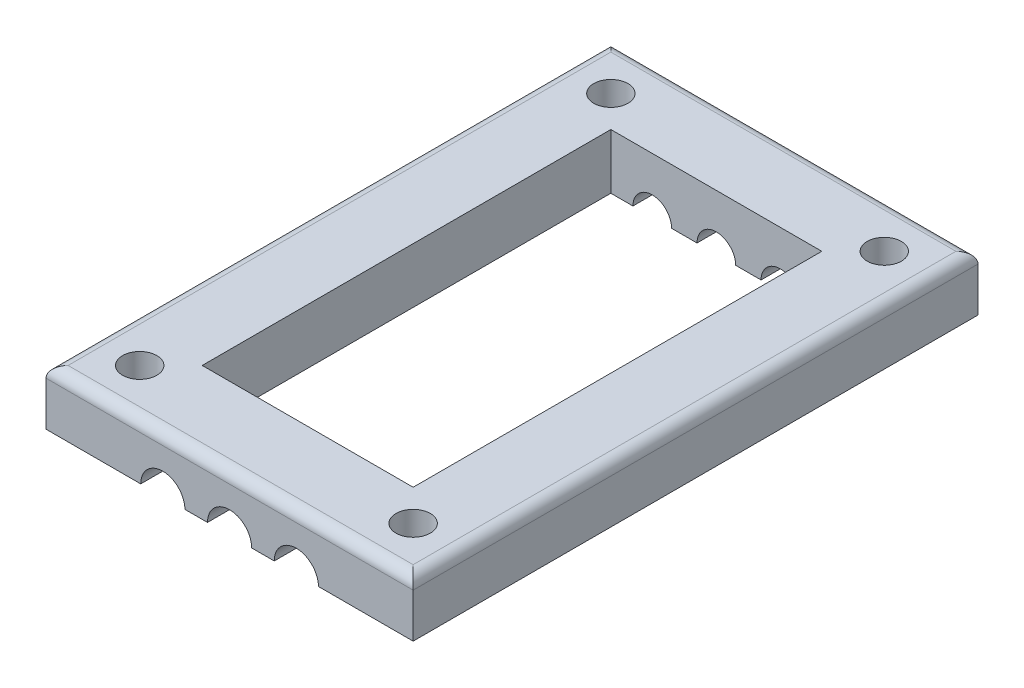
ISO-10303-21;
HEADER;
FILE_DESCRIPTION(('STEP AP214'),'2;1');
FILE_NAME('part.step','',(''),(''),'','','');
FILE_SCHEMA(('AUTOMOTIVE_DESIGN { 1 0 10303 214 1 1 1 1 }'));
ENDSEC;
DATA;
#1=APPLICATION_CONTEXT('core data for automotive mechanical design processes');
#2=APPLICATION_PROTOCOL_DEFINITION('international standard','automotive_design',2000,#1);
#3=PRODUCT_CONTEXT('',#1,'mechanical');
#4=PRODUCT('Part','Part','',(#3));
#5=PRODUCT_RELATED_PRODUCT_CATEGORY('part','',(#4));
#6=PRODUCT_DEFINITION_FORMATION('','',#4);
#7=PRODUCT_DEFINITION_CONTEXT('part definition',#1,'design');
#8=PRODUCT_DEFINITION('design','',#6,#7);
#9=PRODUCT_DEFINITION_SHAPE('','',#8);
#10=(LENGTH_UNIT() NAMED_UNIT(*) SI_UNIT(.MILLI.,.METRE.));
#11=(NAMED_UNIT(*) PLANE_ANGLE_UNIT() SI_UNIT($,.RADIAN.));
#12=(NAMED_UNIT(*) SI_UNIT($,.STERADIAN.) SOLID_ANGLE_UNIT());
#13=UNCERTAINTY_MEASURE_WITH_UNIT(LENGTH_MEASURE(1.E-05),#10,'distance_accuracy_value','');
#14=(GEOMETRIC_REPRESENTATION_CONTEXT(3) GLOBAL_UNCERTAINTY_ASSIGNED_CONTEXT((#13)) GLOBAL_UNIT_ASSIGNED_CONTEXT((#10,
#11,#12)) REPRESENTATION_CONTEXT('',''));
#15=CARTESIAN_POINT('',(0.,0.,0.));
#16=DIRECTION('',(0.,0.,1.));
#17=DIRECTION('',(1.,0.,0.));
#18=AXIS2_PLACEMENT_3D('',#15,#16,#17);
#19=CARTESIAN_POINT('',(-16.6210678118655,25.1031353824411,-35.5810678118655));
#20=DIRECTION('',(0.,-1.,0.));
#21=DIRECTION('',(1.,0.,0.));
#22=AXIS2_PLACEMENT_3D('',#19,#20,#21);
#23=PLANE('',#22);
#24=DIRECTION('',(1.,0.,0.));
#25=VECTOR('',#24,1.);
#26=CARTESIAN_POINT('',(-9.55,25.1031353824411,-28.5));
#27=LINE('',#26,#25);
#28=CARTESIAN_POINT('',(-4.04999999999999,25.1031353824411,-28.5));
#29=VERTEX_POINT('',#28);
#30=CARTESIAN_POINT('',(-1.75,25.1031353824411,-28.5));
#31=VERTEX_POINT('',#30);
#32=EDGE_CURVE('E340',#29,#31,#27,.T.);
#33=ORIENTED_EDGE('',*,*,#32,.F.);
#34=DIRECTION('',(0.,0.,1.));
#35=VECTOR('',#34,1.);
#36=CARTESIAN_POINT('',(-4.04999999999999,25.1031353824411,-35.5720678118655));
#37=LINE('',#36,#35);
#38=CARTESIAN_POINT('',(-4.04999999999999,25.1031353824411,-35.5710678118655));
#39=VERTEX_POINT('',#38);
#40=EDGE_CURVE('E359',#29,#39,#37,.F.);
#41=ORIENTED_EDGE('',*,*,#40,.T.);
#42=DIRECTION('',(-1.,0.,0.));
#43=VECTOR('',#42,1.);
#44=CARTESIAN_POINT('',(0.,25.1031353824411,-35.5710678118655));
#45=LINE('',#44,#43);
#46=CARTESIAN_POINT('',(-1.75,25.1031353824411,-35.5710678118655));
#47=VERTEX_POINT('',#46);
#48=EDGE_CURVE('E409',#47,#39,#45,.T.);
#49=ORIENTED_EDGE('',*,*,#48,.F.);
#50=DIRECTION('',(0.,0.,1.));
#51=VECTOR('',#50,1.);
#52=CARTESIAN_POINT('',(-1.75,25.1031353824411,-35.5720678118655));
#53=LINE('',#52,#51);
#54=EDGE_CURVE('E368',#47,#31,#53,.T.);
#55=ORIENTED_EDGE('',*,*,#54,.T.);
#56=EDGE_LOOP('',(#33,#41,#49,#55));
#57=FACE_BOUND('',#56,.T.);
#58=ADVANCED_FACE('F43',(#57),#23,.T.);
#59=CARTESIAN_POINT('',(1.75000000000001,25.1031353824411,-28.5));
#60=VERTEX_POINT('',#59);
#61=CARTESIAN_POINT('',(4.05,25.1031353824411,-28.5));
#62=VERTEX_POINT('',#61);
#63=EDGE_CURVE('E449',#60,#62,#27,.T.);
#64=ORIENTED_EDGE('',*,*,#63,.F.);
#65=DIRECTION('',(0.,0.,1.));
#66=VECTOR('',#65,1.);
#67=CARTESIAN_POINT('',(1.75000000000001,25.1031353824411,-35.5720678118655));
#68=LINE('',#67,#66);
#69=CARTESIAN_POINT('',(1.75000000000001,25.1031353824411,-35.5710678118655));
#70=VERTEX_POINT('',#69);
#71=EDGE_CURVE('E365',#60,#70,#68,.F.);
#72=ORIENTED_EDGE('',*,*,#71,.T.);
#73=CARTESIAN_POINT('',(4.05,25.1031353824411,-35.5710678118655));
#74=VERTEX_POINT('',#73);
#75=EDGE_CURVE('E351',#74,#70,#45,.T.);
#76=ORIENTED_EDGE('',*,*,#75,.F.);
#77=DIRECTION('',(0.,0.,1.));
#78=VECTOR('',#77,1.);
#79=CARTESIAN_POINT('',(4.05,25.1031353824411,-35.5720678118655));
#80=LINE('',#79,#78);
#81=EDGE_CURVE('E374',#74,#62,#80,.T.);
#82=ORIENTED_EDGE('',*,*,#81,.T.);
#83=EDGE_LOOP('',(#64,#72,#76,#82));
#84=FACE_BOUND('',#83,.T.);
#85=ADVANCED_FACE('F445',(#84),#23,.T.);
#86=DIRECTION('',(-1.,0.,0.));
#87=VECTOR('',#86,1.);
#88=CARTESIAN_POINT('',(0.,25.1031353824411,15.5710678118655));
#89=LINE('',#88,#87);
#90=CARTESIAN_POINT('',(4.045,25.1031353824411,15.5710678118655));
#91=VERTEX_POINT('',#90);
#92=CARTESIAN_POINT('',(2.00000000000001,25.1031353824411,15.5710678118655));
#93=VERTEX_POINT('',#92);
#94=EDGE_CURVE('E389',#91,#93,#89,.T.);
#95=ORIENTED_EDGE('',*,*,#94,.T.);
#96=DIRECTION('',(0.,0.,-1.));
#97=VECTOR('',#96,1.);
#98=CARTESIAN_POINT('',(2.00000000000001,25.1031353824411,15.5720678118655));
#99=LINE('',#98,#97);
#100=CARTESIAN_POINT('',(2.00000000000001,25.1031353824411,8.5));
#101=VERTEX_POINT('',#100);
#102=EDGE_CURVE('E380',#93,#101,#99,.T.);
#103=ORIENTED_EDGE('',*,*,#102,.T.);
#104=DIRECTION('',(-1.,0.,0.));
#105=VECTOR('',#104,1.);
#106=CARTESIAN_POINT('',(-9.55,25.1031353824411,8.5));
#107=LINE('',#106,#105);
#108=CARTESIAN_POINT('',(4.045,25.1031353824411,8.5));
#109=VERTEX_POINT('',#108);
#110=EDGE_CURVE('E334',#109,#101,#107,.T.);
#111=ORIENTED_EDGE('',*,*,#110,.F.);
#112=DIRECTION('',(0.,0.,-1.));
#113=VECTOR('',#112,1.);
#114=CARTESIAN_POINT('',(4.045,25.1031353824411,15.5720678118655));
#115=LINE('',#114,#113);
#116=EDGE_CURVE('E229',#109,#91,#115,.F.);
#117=ORIENTED_EDGE('',*,*,#116,.T.);
#118=EDGE_LOOP('',(#95,#103,#111,#117));
#119=FACE_BOUND('',#118,.T.);
#120=ADVANCED_FACE('F387',(#119),#23,.T.);
#121=CARTESIAN_POINT('',(16.6210678118655,25.1031353824411,-35.5710678118655));
#122=VERTEX_POINT('',#121);
#123=CARTESIAN_POINT('',(7.55000000000001,25.1031353824411,-35.5710678118655));
#124=VERTEX_POINT('',#123);
#125=EDGE_CURVE('E348',#122,#124,#45,.T.);
#126=ORIENTED_EDGE('',*,*,#125,.F.);
#127=DIRECTION('',(0.,0.,1.));
#128=VECTOR('',#127,1.);
#129=CARTESIAN_POINT('',(16.6210678118655,25.1031353824411,-35.5810678118655));
#130=LINE('',#129,#128);
#131=CARTESIAN_POINT('',(16.6210678118655,25.1031353824411,15.5710678118655));
#132=VERTEX_POINT('',#131);
#133=EDGE_CURVE('E352',#122,#132,#130,.T.);
#134=ORIENTED_EDGE('',*,*,#133,.T.);
#135=CARTESIAN_POINT('',(8.04500000000001,25.1031353824411,15.5710678118655));
#136=VERTEX_POINT('',#135);
#137=EDGE_CURVE('E355',#132,#136,#89,.T.);
#138=ORIENTED_EDGE('',*,*,#137,.T.);
#139=DIRECTION('',(0.,0.,-1.));
#140=VECTOR('',#139,1.);
#141=CARTESIAN_POINT('',(8.04500000000001,25.1031353824411,15.5720678118655));
#142=LINE('',#141,#140);
#143=CARTESIAN_POINT('',(8.04500000000001,25.1031353824411,8.5));
#144=VERTEX_POINT('',#143);
#145=EDGE_CURVE('E225',#136,#144,#142,.T.);
#146=ORIENTED_EDGE('',*,*,#145,.T.);
#147=CARTESIAN_POINT('',(9.55,25.1031353824411,8.5));
#148=VERTEX_POINT('',#147);
#149=EDGE_CURVE('E222',#148,#144,#107,.T.);
#150=ORIENTED_EDGE('',*,*,#149,.F.);
#151=DIRECTION('',(0.,0.,1.));
#152=VECTOR('',#151,1.);
#153=CARTESIAN_POINT('',(9.55,25.1031353824411,-28.5));
#154=LINE('',#153,#152);
#155=CARTESIAN_POINT('',(9.55,25.1031353824411,-28.5));
#156=VERTEX_POINT('',#155);
#157=EDGE_CURVE('E341',#156,#148,#154,.T.);
#158=ORIENTED_EDGE('',*,*,#157,.F.);
#159=CARTESIAN_POINT('',(7.55000000000001,25.1031353824411,-28.5));
#160=VERTEX_POINT('',#159);
#161=EDGE_CURVE('E336',#160,#156,#27,.T.);
#162=ORIENTED_EDGE('',*,*,#161,.F.);
#163=DIRECTION('',(0.,0.,1.));
#164=VECTOR('',#163,1.);
#165=CARTESIAN_POINT('',(7.55000000000001,25.1031353824411,-35.5720678118655));
#166=LINE('',#165,#164);
#167=EDGE_CURVE('E371',#160,#124,#166,.F.);
#168=ORIENTED_EDGE('',*,*,#167,.T.);
#169=EDGE_LOOP('',(#126,#134,#138,#146,#150,#158,#162,#168));
#170=FACE_BOUND('',#169,.T.);
#171=CARTESIAN_POINT('',(12.3784271247462,25.1031353824411,-31.3284271247462));
#172=DIRECTION('',(0.,-1.,0.));
#173=DIRECTION('',(1.,0.,0.));
#174=AXIS2_PLACEMENT_3D('',#171,#172,#173);
#175=CIRCLE('',#174,1.54999999999999);
#176=CARTESIAN_POINT('',(13.9284271247462,25.1031353824411,-31.3284271247462));
#177=VERTEX_POINT('',#176);
#178=EDGE_CURVE('E325',#177,#177,#175,.T.);
#179=ORIENTED_EDGE('',*,*,#178,.F.);
#180=EDGE_LOOP('',(#179));
#181=FACE_BOUND('',#180,.T.);
#182=CARTESIAN_POINT('',(12.3784271247462,25.1031353824411,11.3284271247462));
#183=DIRECTION('',(0.,-1.,0.));
#184=DIRECTION('',(1.,0.,0.));
#185=AXIS2_PLACEMENT_3D('',#182,#183,#184);
#186=CIRCLE('',#185,1.55);
#187=CARTESIAN_POINT('',(13.9284271247462,25.1031353824411,11.3284271247462));
#188=VERTEX_POINT('',#187);
#189=EDGE_CURVE('E328',#188,#188,#186,.T.);
#190=ORIENTED_EDGE('',*,*,#189,.F.);
#191=EDGE_LOOP('',(#190));
#192=FACE_BOUND('',#191,.T.);
#193=ADVANCED_FACE('F435',(#170,#181,#192),#23,.T.);
#194=CARTESIAN_POINT('',(-7.55,25.1031353824411,-35.5710678118655));
#195=VERTEX_POINT('',#194);
#196=CARTESIAN_POINT('',(-16.6210678118655,25.1031353824411,-35.5710678118655));
#197=VERTEX_POINT('',#196);
#198=EDGE_CURVE('E347',#195,#197,#45,.T.);
#199=ORIENTED_EDGE('',*,*,#198,.F.);
#200=DIRECTION('',(0.,0.,1.));
#201=VECTOR('',#200,1.);
#202=CARTESIAN_POINT('',(-7.55,25.1031353824411,-35.5720678118655));
#203=LINE('',#202,#201);
#204=CARTESIAN_POINT('',(-7.55,25.1031353824411,-28.5));
#205=VERTEX_POINT('',#204);
#206=EDGE_CURVE('E362',#195,#205,#203,.T.);
#207=ORIENTED_EDGE('',*,*,#206,.T.);
#208=CARTESIAN_POINT('',(-9.55,25.1031353824411,-28.5));
#209=VERTEX_POINT('',#208);
#210=EDGE_CURVE('E337',#209,#205,#27,.T.);
#211=ORIENTED_EDGE('',*,*,#210,.F.);
#212=DIRECTION('',(0.,0.,-1.));
#213=VECTOR('',#212,1.);
#214=CARTESIAN_POINT('',(-9.55,25.1031353824411,-28.5));
#215=LINE('',#214,#213);
#216=CARTESIAN_POINT('',(-9.55,25.1031353824411,8.5));
#217=VERTEX_POINT('',#216);
#218=EDGE_CURVE('E218',#217,#209,#215,.T.);
#219=ORIENTED_EDGE('',*,*,#218,.F.);
#220=CARTESIAN_POINT('',(-8.045,25.1031353824411,8.5));
#221=VERTEX_POINT('',#220);
#222=EDGE_CURVE('E199',#221,#217,#107,.T.);
#223=ORIENTED_EDGE('',*,*,#222,.F.);
#224=DIRECTION('',(0.,0.,-1.));
#225=VECTOR('',#224,1.);
#226=CARTESIAN_POINT('',(-8.045,25.1031353824411,15.5720678118655));
#227=LINE('',#226,#225);
#228=CARTESIAN_POINT('',(-8.045,25.1031353824411,15.5710678118655));
#229=VERTEX_POINT('',#228);
#230=EDGE_CURVE('E216',#221,#229,#227,.F.);
#231=ORIENTED_EDGE('',*,*,#230,.T.);
#232=CARTESIAN_POINT('',(-16.6210678118655,25.1031353824411,15.5710678118655));
#233=VERTEX_POINT('',#232);
#234=EDGE_CURVE('E356',#229,#233,#89,.T.);
#235=ORIENTED_EDGE('',*,*,#234,.T.);
#236=DIRECTION('',(0.,0.,1.));
#237=VECTOR('',#236,1.);
#238=CARTESIAN_POINT('',(-16.6210678118655,25.1031353824411,-35.5810678118655));
#239=LINE('',#238,#237);
#240=EDGE_CURVE('E344',#197,#233,#239,.T.);
#241=ORIENTED_EDGE('',*,*,#240,.F.);
#242=EDGE_LOOP('',(#199,#207,#211,#219,#223,#231,#235,#241));
#243=FACE_BOUND('',#242,.T.);
#244=CARTESIAN_POINT('',(-12.3784271247462,25.1031353824411,-31.3284271247462));
#245=DIRECTION('',(0.,-1.,0.));
#246=DIRECTION('',(1.,0.,0.));
#247=AXIS2_PLACEMENT_3D('',#244,#245,#246);
#248=CIRCLE('',#247,1.54999999999999);
#249=CARTESIAN_POINT('',(-10.8284271247462,25.1031353824411,-31.3284271247462));
#250=VERTEX_POINT('',#249);
#251=EDGE_CURVE('E292',#250,#250,#248,.T.);
#252=ORIENTED_EDGE('',*,*,#251,.F.);
#253=EDGE_LOOP('',(#252));
#254=FACE_BOUND('',#253,.T.);
#255=CARTESIAN_POINT('',(-12.3784271247462,25.1031353824411,11.3284271247462));
#256=DIRECTION('',(0.,-1.,0.));
#257=DIRECTION('',(1.,0.,0.));
#258=AXIS2_PLACEMENT_3D('',#255,#256,#257);
#259=CIRCLE('',#258,1.55);
#260=CARTESIAN_POINT('',(-10.8284271247462,25.1031353824411,11.3284271247462));
#261=VERTEX_POINT('',#260);
#262=EDGE_CURVE('E220',#261,#261,#259,.T.);
#263=ORIENTED_EDGE('',*,*,#262,.F.);
#264=EDGE_LOOP('',(#263));
#265=FACE_BOUND('',#264,.T.);
#266=ADVANCED_FACE('F213',(#243,#254,#265),#23,.T.);
#267=CARTESIAN_POINT('',(-2.,25.1031353824411,8.5));
#268=VERTEX_POINT('',#267);
#269=CARTESIAN_POINT('',(-4.045,25.1031353824411,8.5));
#270=VERTEX_POINT('',#269);
#271=EDGE_CURVE('E202',#268,#270,#107,.T.);
#272=ORIENTED_EDGE('',*,*,#271,.F.);
#273=DIRECTION('',(0.,0.,-1.));
#274=VECTOR('',#273,1.);
#275=CARTESIAN_POINT('',(-2.,25.1031353824411,15.5720678118655));
#276=LINE('',#275,#274);
#277=CARTESIAN_POINT('',(-2.,25.1031353824411,15.5710678118655));
#278=VERTEX_POINT('',#277);
#279=EDGE_CURVE('E377',#268,#278,#276,.F.);
#280=ORIENTED_EDGE('',*,*,#279,.T.);
#281=CARTESIAN_POINT('',(-4.045,25.1031353824411,15.5710678118655));
#282=VERTEX_POINT('',#281);
#283=EDGE_CURVE('E358',#278,#282,#89,.T.);
#284=ORIENTED_EDGE('',*,*,#283,.T.);
#285=DIRECTION('',(0.,0.,-1.));
#286=VECTOR('',#285,1.);
#287=CARTESIAN_POINT('',(-4.045,25.1031353824411,15.5720678118655));
#288=LINE('',#287,#286);
#289=EDGE_CURVE('E226',#282,#270,#288,.T.);
#290=ORIENTED_EDGE('',*,*,#289,.T.);
#291=EDGE_LOOP('',(#272,#280,#284,#290));
#292=FACE_BOUND('',#291,.T.);
#293=ADVANCED_FACE('F399',(#292),#23,.T.);
#294=CARTESIAN_POINT('',(-15.6210678118655,29.1031353824411,0.));
#295=DIRECTION('',(0.,0.,-1.));
#296=DIRECTION('',(-1.,0.,0.));
#297=AXIS2_PLACEMENT_3D('',#294,#295,#296);
#298=CYLINDRICAL_SURFACE('',#297,1.);
#299=CARTESIAN_POINT('',(-15.6210678118655,29.1031353824411,-34.5710678118655));
#300=DIRECTION('',(-0.707106781186547,0.,0.707106781186547));
#301=DIRECTION('',(-0.707106781186547,0.,-0.707106781186547));
#302=AXIS2_PLACEMENT_3D('',#299,#300,#301);
#303=ELLIPSE('',#302,1.41421356237309,1.);
#304=CARTESIAN_POINT('',(-15.6210678118655,30.1031353824411,-34.5710678118655));
#305=VERTEX_POINT('',#304);
#306=CARTESIAN_POINT('',(-16.6210678118655,29.1031353824411,-35.5710678118655));
#307=VERTEX_POINT('',#306);
#308=EDGE_CURVE('E275',#305,#307,#303,.T.);
#309=ORIENTED_EDGE('',*,*,#308,.T.);
#310=DIRECTION('',(0.,0.,1.));
#311=VECTOR('',#310,1.);
#312=CARTESIAN_POINT('',(-16.6210678118655,29.1031353824411,-35.5710678118655));
#313=LINE('',#312,#311);
#314=CARTESIAN_POINT('',(-16.6210678118655,29.1031353824411,15.5710678118655));
#315=VERTEX_POINT('',#314);
#316=EDGE_CURVE('E298',#315,#307,#313,.F.);
#317=ORIENTED_EDGE('',*,*,#316,.F.);
#318=CARTESIAN_POINT('',(-15.6210678118655,29.1031353824411,14.5710678118655));
#319=DIRECTION('',(-0.707106781186547,0.,-0.707106781186547));
#320=DIRECTION('',(0.707106781186547,0.,-0.707106781186547));
#321=AXIS2_PLACEMENT_3D('',#318,#319,#320);
#322=ELLIPSE('',#321,1.41421356237309,1.);
#323=CARTESIAN_POINT('',(-15.6210678118655,30.1031353824411,14.5710678118655));
#324=VERTEX_POINT('',#323);
#325=EDGE_CURVE('E52',#324,#315,#322,.F.);
#326=ORIENTED_EDGE('',*,*,#325,.F.);
#327=DIRECTION('',(0.,0.,1.));
#328=VECTOR('',#327,1.);
#329=CARTESIAN_POINT('',(-15.6210678118655,30.1031353824411,15.5710678118655));
#330=LINE('',#329,#328);
#331=EDGE_CURVE('E291',#305,#324,#330,.T.);
#332=ORIENTED_EDGE('',*,*,#331,.F.);
#333=EDGE_LOOP('',(#309,#317,#326,#332));
#334=FACE_BOUND('',#333,.T.);
#335=ADVANCED_FACE('F412',(#334),#298,.T.);
#336=CARTESIAN_POINT('',(0.,20.1031353824411,-35.5710678118655));
#337=DIRECTION('',(0.,0.,-1.));
#338=DIRECTION('',(-1.,0.,0.));
#339=AXIS2_PLACEMENT_3D('',#336,#337,#338);
#340=PLANE('',#339);
#341=DIRECTION('',(0.,-1.,0.));
#342=VECTOR('',#341,1.);
#343=CARTESIAN_POINT('',(16.6210678118655,20.1031353824411,-35.5710678118655));
#344=LINE('',#343,#342);
#345=CARTESIAN_POINT('',(16.6210678118655,29.1031353824411,-35.5710678118655));
#346=VERTEX_POINT('',#345);
#347=EDGE_CURVE('E234',#346,#122,#344,.T.);
#348=ORIENTED_EDGE('',*,*,#347,.T.);
#349=ORIENTED_EDGE('',*,*,#125,.T.);
#350=CARTESIAN_POINT('',(5.8,25.1031353824411,-35.5710678118655));
#351=DIRECTION('',(0.,0.,-1.));
#352=DIRECTION('',(-1.,0.,0.));
#353=AXIS2_PLACEMENT_3D('',#350,#351,#352);
#354=CIRCLE('',#353,1.75);
#355=EDGE_CURVE('E256',#124,#74,#354,.F.);
#356=ORIENTED_EDGE('',*,*,#355,.T.);
#357=ORIENTED_EDGE('',*,*,#75,.T.);
#358=CARTESIAN_POINT('',(0.,25.1031353824411,-35.5710678118655));
#359=DIRECTION('',(0.,0.,-1.));
#360=DIRECTION('',(-1.,0.,0.));
#361=AXIS2_PLACEMENT_3D('',#358,#359,#360);
#362=CIRCLE('',#361,1.75);
#363=EDGE_CURVE('E259',#70,#47,#362,.F.);
#364=ORIENTED_EDGE('',*,*,#363,.T.);
#365=ORIENTED_EDGE('',*,*,#48,.T.);
#366=CARTESIAN_POINT('',(-5.8,25.1031353824411,-35.5710678118655));
#367=DIRECTION('',(0.,0.,-1.));
#368=DIRECTION('',(-1.,0.,0.));
#369=AXIS2_PLACEMENT_3D('',#366,#367,#368);
#370=CIRCLE('',#369,1.75);
#371=EDGE_CURVE('E263',#39,#195,#370,.F.);
#372=ORIENTED_EDGE('',*,*,#371,.T.);
#373=ORIENTED_EDGE('',*,*,#198,.T.);
#374=DIRECTION('',(0.,-1.,0.));
#375=VECTOR('',#374,1.);
#376=CARTESIAN_POINT('',(-16.6210678118655,20.1031353824411,-35.5710678118655));
#377=LINE('',#376,#375);
#378=EDGE_CURVE('E237',#307,#197,#377,.T.);
#379=ORIENTED_EDGE('',*,*,#378,.F.);
#380=DIRECTION('',(-1.,0.,0.));
#381=VECTOR('',#380,1.);
#382=CARTESIAN_POINT('',(0.,29.1031353824411,-35.5710678118655));
#383=LINE('',#382,#381);
#384=EDGE_CURVE('E300',#307,#346,#383,.F.);
#385=ORIENTED_EDGE('',*,*,#384,.T.);
#386=EDGE_LOOP('',(#348,#349,#356,#357,#364,#365,#372,#373,#379,#385));
#387=FACE_BOUND('',#386,.T.);
#388=ADVANCED_FACE('F406',(#387),#340,.T.);
#389=CARTESIAN_POINT('',(0.,29.1031353824411,-34.5710678118655));
#390=DIRECTION('',(-1.,0.,0.));
#391=DIRECTION('',(0.,0.,1.));
#392=AXIS2_PLACEMENT_3D('',#389,#390,#391);
#393=CYLINDRICAL_SURFACE('',#392,1.);
#394=CARTESIAN_POINT('',(15.6210678118655,29.1031353824411,-34.5710678118655));
#395=DIRECTION('',(-0.707106781186547,0.,-0.707106781186547));
#396=DIRECTION('',(0.707106781186547,0.,-0.707106781186547));
#397=AXIS2_PLACEMENT_3D('',#394,#395,#396);
#398=ELLIPSE('',#397,1.41421356237309,1.);
#399=CARTESIAN_POINT('',(15.6210678118655,30.1031353824411,-34.5710678118655));
#400=VERTEX_POINT('',#399);
#401=EDGE_CURVE('E278',#346,#400,#398,.F.);
#402=ORIENTED_EDGE('',*,*,#401,.F.);
#403=ORIENTED_EDGE('',*,*,#384,.F.);
#404=ORIENTED_EDGE('',*,*,#308,.F.);
#405=DIRECTION('',(-1.,0.,0.));
#406=VECTOR('',#405,1.);
#407=CARTESIAN_POINT('',(0.,30.1031353824411,-34.5710678118655));
#408=LINE('',#407,#406);
#409=EDGE_CURVE('E294',#400,#305,#408,.T.);
#410=ORIENTED_EDGE('',*,*,#409,.F.);
#411=EDGE_LOOP('',(#402,#403,#404,#410));
#412=FACE_BOUND('',#411,.T.);
#413=ADVANCED_FACE('F429',(#412),#393,.T.);
#414=CARTESIAN_POINT('',(-9.55,30.1031353824411,-28.5));
#415=DIRECTION('',(0.,0.,1.));
#416=DIRECTION('',(1.,0.,0.));
#417=AXIS2_PLACEMENT_3D('',#414,#415,#416);
#418=PLANE('',#417);
#419=DIRECTION('',(0.,-1.,0.));
#420=VECTOR('',#419,1.);
#421=CARTESIAN_POINT('',(-9.55,30.1031353824411,-28.5));
#422=LINE('',#421,#420);
#423=CARTESIAN_POINT('',(-9.55,30.1031353824411,-28.5));
#424=VERTEX_POINT('',#423);
#425=EDGE_CURVE('E247',#424,#209,#422,.T.);
#426=ORIENTED_EDGE('',*,*,#425,.T.);
#427=ORIENTED_EDGE('',*,*,#210,.T.);
#428=CARTESIAN_POINT('',(-5.8,25.1031353824411,-28.5));
#429=DIRECTION('',(0.,0.,1.));
#430=DIRECTION('',(1.,0.,0.));
#431=AXIS2_PLACEMENT_3D('',#428,#429,#430);
#432=CIRCLE('',#431,1.75);
#433=EDGE_CURVE('E265',#29,#205,#432,.T.);
#434=ORIENTED_EDGE('',*,*,#433,.F.);
#435=ORIENTED_EDGE('',*,*,#32,.T.);
#436=CARTESIAN_POINT('',(0.,25.1031353824411,-28.5));
#437=DIRECTION('',(0.,0.,1.));
#438=DIRECTION('',(1.,0.,0.));
#439=AXIS2_PLACEMENT_3D('',#436,#437,#438);
#440=CIRCLE('',#439,1.75);
#441=EDGE_CURVE('E261',#60,#31,#440,.T.);
#442=ORIENTED_EDGE('',*,*,#441,.F.);
#443=ORIENTED_EDGE('',*,*,#63,.T.);
#444=CARTESIAN_POINT('',(5.8,25.1031353824411,-28.5));
#445=DIRECTION('',(0.,0.,1.));
#446=DIRECTION('',(1.,0.,0.));
#447=AXIS2_PLACEMENT_3D('',#444,#445,#446);
#448=CIRCLE('',#447,1.75);
#449=EDGE_CURVE('E254',#160,#62,#448,.T.);
#450=ORIENTED_EDGE('',*,*,#449,.F.);
#451=ORIENTED_EDGE('',*,*,#161,.T.);
#452=DIRECTION('',(0.,-1.,0.));
#453=VECTOR('',#452,1.);
#454=CARTESIAN_POINT('',(9.55,30.1031353824411,-28.5));
#455=LINE('',#454,#453);
#456=CARTESIAN_POINT('',(9.55,30.1031353824411,-28.5));
#457=VERTEX_POINT('',#456);
#458=EDGE_CURVE('E245',#457,#156,#455,.T.);
#459=ORIENTED_EDGE('',*,*,#458,.F.);
#460=DIRECTION('',(-1.,0.,0.));
#461=VECTOR('',#460,1.);
#462=CARTESIAN_POINT('',(-9.55,30.1031353824411,-28.5));
#463=LINE('',#462,#461);
#464=EDGE_CURVE('E67',#457,#424,#463,.T.);
#465=ORIENTED_EDGE('',*,*,#464,.T.);
#466=EDGE_LOOP('',(#426,#427,#434,#435,#442,#443,#450,#451,#459,#465));
#467=FACE_BOUND('',#466,.T.);
#468=ADVANCED_FACE('F450',(#467),#418,.T.);
#469=CARTESIAN_POINT('',(5.8,25.1031353824411,-35.5720678118655));
#470=DIRECTION('',(0.,0.,1.));
#471=DIRECTION('',(1.,0.,0.));
#472=AXIS2_PLACEMENT_3D('',#469,#470,#471);
#473=CYLINDRICAL_SURFACE('',#472,1.75);
#474=ORIENTED_EDGE('',*,*,#167,.F.);
#475=ORIENTED_EDGE('',*,*,#449,.T.);
#476=ORIENTED_EDGE('',*,*,#81,.F.);
#477=ORIENTED_EDGE('',*,*,#355,.F.);
#478=EDGE_LOOP('',(#474,#475,#476,#477));
#479=FACE_BOUND('',#478,.T.);
#480=ADVANCED_FACE('F447',(#479),#473,.F.);
#481=CARTESIAN_POINT('',(0.,25.1031353824411,-35.5720678118655));
#482=DIRECTION('',(0.,0.,1.));
#483=DIRECTION('',(1.,0.,0.));
#484=AXIS2_PLACEMENT_3D('',#481,#482,#483);
#485=CYLINDRICAL_SURFACE('',#484,1.75);
#486=ORIENTED_EDGE('',*,*,#71,.F.);
#487=ORIENTED_EDGE('',*,*,#441,.T.);
#488=ORIENTED_EDGE('',*,*,#54,.F.);
#489=ORIENTED_EDGE('',*,*,#363,.F.);
#490=EDGE_LOOP('',(#486,#487,#488,#489));
#491=FACE_BOUND('',#490,.T.);
#492=ADVANCED_FACE('F458',(#491),#485,.F.);
#493=CARTESIAN_POINT('',(-5.8,25.1031353824411,-35.5720678118655));
#494=DIRECTION('',(0.,0.,1.));
#495=DIRECTION('',(1.,0.,0.));
#496=AXIS2_PLACEMENT_3D('',#493,#494,#495);
#497=CYLINDRICAL_SURFACE('',#496,1.75);
#498=ORIENTED_EDGE('',*,*,#40,.F.);
#499=ORIENTED_EDGE('',*,*,#433,.T.);
#500=ORIENTED_EDGE('',*,*,#206,.F.);
#501=ORIENTED_EDGE('',*,*,#371,.F.);
#502=EDGE_LOOP('',(#498,#499,#500,#501));
#503=FACE_BOUND('',#502,.T.);
#504=ADVANCED_FACE('F460',(#503),#497,.F.);
#505=CARTESIAN_POINT('',(-9.55,30.1031353824411,-28.5));
#506=DIRECTION('',(1.,0.,0.));
#507=DIRECTION('',(0.,0.,-1.));
#508=AXIS2_PLACEMENT_3D('',#505,#506,#507);
#509=PLANE('',#508);
#510=DIRECTION('',(0.,-1.,0.));
#511=VECTOR('',#510,1.);
#512=CARTESIAN_POINT('',(-9.55,30.1031353824411,8.5));
#513=LINE('',#512,#511);
#514=CARTESIAN_POINT('',(-9.55,30.1031353824411,8.5));
#515=VERTEX_POINT('',#514);
#516=EDGE_CURVE('E249',#515,#217,#513,.T.);
#517=ORIENTED_EDGE('',*,*,#516,.T.);
#518=ORIENTED_EDGE('',*,*,#218,.T.);
#519=ORIENTED_EDGE('',*,*,#425,.F.);
#520=DIRECTION('',(0.,0.,1.));
#521=VECTOR('',#520,1.);
#522=CARTESIAN_POINT('',(-9.55,30.1031353824411,-28.5));
#523=LINE('',#522,#521);
#524=EDGE_CURVE('E307',#424,#515,#523,.T.);
#525=ORIENTED_EDGE('',*,*,#524,.T.);
#526=EDGE_LOOP('',(#517,#518,#519,#525));
#527=FACE_BOUND('',#526,.T.);
#528=ADVANCED_FACE('F463',(#527),#509,.T.);
#529=CARTESIAN_POINT('',(9.55,30.1031353824411,-28.5));
#530=DIRECTION('',(-1.,0.,0.));
#531=DIRECTION('',(0.,0.,1.));
#532=AXIS2_PLACEMENT_3D('',#529,#530,#531);
#533=PLANE('',#532);
#534=ORIENTED_EDGE('',*,*,#458,.T.);
#535=ORIENTED_EDGE('',*,*,#157,.T.);
#536=DIRECTION('',(0.,-1.,0.));
#537=VECTOR('',#536,1.);
#538=CARTESIAN_POINT('',(9.55,30.1031353824411,8.5));
#539=LINE('',#538,#537);
#540=CARTESIAN_POINT('',(9.55,30.1031353824411,8.5));
#541=VERTEX_POINT('',#540);
#542=EDGE_CURVE('E251',#541,#148,#539,.T.);
#543=ORIENTED_EDGE('',*,*,#542,.F.);
#544=DIRECTION('',(0.,0.,-1.));
#545=VECTOR('',#544,1.);
#546=CARTESIAN_POINT('',(9.55,30.1031353824411,-28.5));
#547=LINE('',#546,#545);
#548=EDGE_CURVE('E60',#541,#457,#547,.T.);
#549=ORIENTED_EDGE('',*,*,#548,.T.);
#550=EDGE_LOOP('',(#534,#535,#543,#549));
#551=FACE_BOUND('',#550,.T.);
#552=ADVANCED_FACE('F467',(#551),#533,.T.);
#553=CARTESIAN_POINT('',(0.,20.1031353824411,15.5710678118655));
#554=DIRECTION('',(0.,0.,-1.));
#555=DIRECTION('',(-1.,0.,0.));
#556=AXIS2_PLACEMENT_3D('',#553,#554,#555);
#557=PLANE('',#556);
#558=ORIENTED_EDGE('',*,*,#137,.F.);
#559=DIRECTION('',(0.,-1.,0.));
#560=VECTOR('',#559,1.);
#561=CARTESIAN_POINT('',(16.6210678118655,20.1031353824411,15.5710678118655));
#562=LINE('',#561,#560);
#563=CARTESIAN_POINT('',(16.6210678118655,29.1031353824411,15.5710678118655));
#564=VERTEX_POINT('',#563);
#565=EDGE_CURVE('E243',#564,#132,#562,.T.);
#566=ORIENTED_EDGE('',*,*,#565,.F.);
#567=DIRECTION('',(1.,0.,0.));
#568=VECTOR('',#567,1.);
#569=CARTESIAN_POINT('',(-16.6210678118655,29.1031353824411,15.5710678118655));
#570=LINE('',#569,#568);
#571=EDGE_CURVE('E238',#564,#315,#570,.F.);
#572=ORIENTED_EDGE('',*,*,#571,.T.);
#573=DIRECTION('',(0.,-1.,0.));
#574=VECTOR('',#573,1.);
#575=CARTESIAN_POINT('',(-16.6210678118655,20.1031353824411,15.5710678118655));
#576=LINE('',#575,#574);
#577=EDGE_CURVE('E241',#315,#233,#576,.T.);
#578=ORIENTED_EDGE('',*,*,#577,.T.);
#579=ORIENTED_EDGE('',*,*,#234,.F.);
#580=CARTESIAN_POINT('',(-6.045,25.1031353824411,15.5710678118655));
#581=DIRECTION('',(0.,0.,-1.));
#582=DIRECTION('',(-1.,0.,0.));
#583=AXIS2_PLACEMENT_3D('',#580,#581,#582);
#584=CIRCLE('',#583,2.);
#585=EDGE_CURVE('E208',#282,#229,#584,.F.);
#586=ORIENTED_EDGE('',*,*,#585,.F.);
#587=ORIENTED_EDGE('',*,*,#283,.F.);
#588=CARTESIAN_POINT('',(0.,25.1031353824411,15.5710678118655));
#589=DIRECTION('',(0.,0.,-1.));
#590=DIRECTION('',(-1.,0.,0.));
#591=AXIS2_PLACEMENT_3D('',#588,#589,#590);
#592=CIRCLE('',#591,2.00000000000001);
#593=EDGE_CURVE('E47',#93,#278,#592,.F.);
#594=ORIENTED_EDGE('',*,*,#593,.F.);
#595=ORIENTED_EDGE('',*,*,#94,.F.);
#596=CARTESIAN_POINT('',(6.045,25.1031353824411,15.5710678118655));
#597=DIRECTION('',(0.,0.,-1.));
#598=DIRECTION('',(-1.,0.,0.));
#599=AXIS2_PLACEMENT_3D('',#596,#597,#598);
#600=CIRCLE('',#599,2.00000000000001);
#601=EDGE_CURVE('E269',#136,#91,#600,.F.);
#602=ORIENTED_EDGE('',*,*,#601,.F.);
#603=EDGE_LOOP('',(#558,#566,#572,#578,#579,#586,#587,#594,#595,#602));
#604=FACE_BOUND('',#603,.T.);
#605=ADVANCED_FACE('F396',(#604),#557,.F.);
#606=CARTESIAN_POINT('',(0.,29.1031353824411,14.5710678118655));
#607=DIRECTION('',(-1.,0.,0.));
#608=DIRECTION('',(0.,0.,1.));
#609=AXIS2_PLACEMENT_3D('',#606,#607,#608);
#610=CYLINDRICAL_SURFACE('',#609,1.);
#611=ORIENTED_EDGE('',*,*,#325,.T.);
#612=ORIENTED_EDGE('',*,*,#571,.F.);
#613=CARTESIAN_POINT('',(15.6210678118655,29.1031353824411,14.5710678118655));
#614=DIRECTION('',(0.707106781186547,0.,-0.707106781186547));
#615=DIRECTION('',(-0.707106781186547,0.,-0.707106781186547));
#616=AXIS2_PLACEMENT_3D('',#613,#614,#615);
#617=ELLIPSE('',#616,1.41421356237309,1.);
#618=CARTESIAN_POINT('',(15.6210678118655,30.1031353824411,14.5710678118655));
#619=VERTEX_POINT('',#618);
#620=EDGE_CURVE('E11',#564,#619,#617,.F.);
#621=ORIENTED_EDGE('',*,*,#620,.T.);
#622=DIRECTION('',(1.,0.,0.));
#623=VECTOR('',#622,1.);
#624=CARTESIAN_POINT('',(16.6210678118655,30.1031353824411,14.5710678118655));
#625=LINE('',#624,#623);
#626=EDGE_CURVE('E288',#324,#619,#625,.T.);
#627=ORIENTED_EDGE('',*,*,#626,.F.);
#628=EDGE_LOOP('',(#611,#612,#621,#627));
#629=FACE_BOUND('',#628,.T.);
#630=ADVANCED_FACE('F418',(#629),#610,.T.);
#631=CARTESIAN_POINT('',(-9.55,30.1031353824411,8.5));
#632=DIRECTION('',(0.,0.,-1.));
#633=DIRECTION('',(-1.,0.,0.));
#634=AXIS2_PLACEMENT_3D('',#631,#632,#633);
#635=PLANE('',#634);
#636=ORIENTED_EDGE('',*,*,#542,.T.);
#637=ORIENTED_EDGE('',*,*,#149,.T.);
#638=CARTESIAN_POINT('',(6.045,25.1031353824411,8.5));
#639=DIRECTION('',(0.,0.,-1.));
#640=DIRECTION('',(-1.,0.,0.));
#641=AXIS2_PLACEMENT_3D('',#638,#639,#640);
#642=CIRCLE('',#641,2.00000000000001);
#643=EDGE_CURVE('E207',#109,#144,#642,.T.);
#644=ORIENTED_EDGE('',*,*,#643,.F.);
#645=ORIENTED_EDGE('',*,*,#110,.T.);
#646=CARTESIAN_POINT('',(0.,25.1031353824411,8.5));
#647=DIRECTION('',(0.,0.,-1.));
#648=DIRECTION('',(-1.,0.,0.));
#649=AXIS2_PLACEMENT_3D('',#646,#647,#648);
#650=CIRCLE('',#649,2.00000000000001);
#651=EDGE_CURVE('E270',#268,#101,#650,.T.);
#652=ORIENTED_EDGE('',*,*,#651,.F.);
#653=ORIENTED_EDGE('',*,*,#271,.T.);
#654=CARTESIAN_POINT('',(-6.045,25.1031353824411,8.5));
#655=DIRECTION('',(0.,0.,-1.));
#656=DIRECTION('',(-1.,0.,0.));
#657=AXIS2_PLACEMENT_3D('',#654,#655,#656);
#658=CIRCLE('',#657,2.);
#659=EDGE_CURVE('E195',#221,#270,#658,.T.);
#660=ORIENTED_EDGE('',*,*,#659,.F.);
#661=ORIENTED_EDGE('',*,*,#222,.T.);
#662=ORIENTED_EDGE('',*,*,#516,.F.);
#663=DIRECTION('',(1.,0.,0.));
#664=VECTOR('',#663,1.);
#665=CARTESIAN_POINT('',(-9.55,30.1031353824411,8.5));
#666=LINE('',#665,#664);
#667=EDGE_CURVE('E253',#515,#541,#666,.T.);
#668=ORIENTED_EDGE('',*,*,#667,.T.);
#669=EDGE_LOOP('',(#636,#637,#644,#645,#652,#653,#660,#661,#662,#668));
#670=FACE_BOUND('',#669,.T.);
#671=ADVANCED_FACE('F198',(#670),#635,.T.);
#672=CARTESIAN_POINT('',(-6.045,25.1031353824411,15.5720678118655));
#673=DIRECTION('',(0.,0.,-1.));
#674=DIRECTION('',(-1.,0.,0.));
#675=AXIS2_PLACEMENT_3D('',#672,#673,#674);
#676=CYLINDRICAL_SURFACE('',#675,2.);
#677=ORIENTED_EDGE('',*,*,#230,.F.);
#678=ORIENTED_EDGE('',*,*,#659,.T.);
#679=ORIENTED_EDGE('',*,*,#289,.F.);
#680=ORIENTED_EDGE('',*,*,#585,.T.);
#681=EDGE_LOOP('',(#677,#678,#679,#680));
#682=FACE_BOUND('',#681,.T.);
#683=ADVANCED_FACE('F223',(#682),#676,.F.);
#684=CARTESIAN_POINT('',(6.045,25.1031353824411,15.5720678118655));
#685=DIRECTION('',(0.,0.,-1.));
#686=DIRECTION('',(-1.,0.,0.));
#687=AXIS2_PLACEMENT_3D('',#684,#685,#686);
#688=CYLINDRICAL_SURFACE('',#687,2.00000000000001);
#689=ORIENTED_EDGE('',*,*,#116,.F.);
#690=ORIENTED_EDGE('',*,*,#643,.T.);
#691=ORIENTED_EDGE('',*,*,#145,.F.);
#692=ORIENTED_EDGE('',*,*,#601,.T.);
#693=EDGE_LOOP('',(#689,#690,#691,#692));
#694=FACE_BOUND('',#693,.T.);
#695=ADVANCED_FACE('F391',(#694),#688,.F.);
#696=CARTESIAN_POINT('',(0.,25.1031353824411,15.5720678118655));
#697=DIRECTION('',(0.,0.,-1.));
#698=DIRECTION('',(-1.,0.,0.));
#699=AXIS2_PLACEMENT_3D('',#696,#697,#698);
#700=CYLINDRICAL_SURFACE('',#699,2.00000000000001);
#701=ORIENTED_EDGE('',*,*,#279,.F.);
#702=ORIENTED_EDGE('',*,*,#651,.T.);
#703=ORIENTED_EDGE('',*,*,#102,.F.);
#704=ORIENTED_EDGE('',*,*,#593,.T.);
#705=EDGE_LOOP('',(#701,#702,#703,#704));
#706=FACE_BOUND('',#705,.T.);
#707=ADVANCED_FACE('F469',(#706),#700,.F.);
#708=CARTESIAN_POINT('',(0.,30.1031353824411,0.));
#709=DIRECTION('',(0.,1.,0.));
#710=DIRECTION('',(0.,0.,1.));
#711=AXIS2_PLACEMENT_3D('',#708,#709,#710);
#712=PLANE('',#711);
#713=ORIENTED_EDGE('',*,*,#331,.T.);
#714=ORIENTED_EDGE('',*,*,#626,.T.);
#715=DIRECTION('',(0.,0.,-1.));
#716=VECTOR('',#715,1.);
#717=CARTESIAN_POINT('',(15.6210678118655,30.1031353824411,0.));
#718=LINE('',#717,#716);
#719=EDGE_CURVE('E296',#619,#400,#718,.T.);
#720=ORIENTED_EDGE('',*,*,#719,.T.);
#721=ORIENTED_EDGE('',*,*,#409,.T.);
#722=EDGE_LOOP('',(#713,#714,#720,#721));
#723=FACE_BOUND('',#722,.T.);
#724=CARTESIAN_POINT('',(12.3784271247462,30.1031353824411,-31.3284271247462));
#725=DIRECTION('',(0.,1.,0.));
#726=DIRECTION('',(0.,0.,1.));
#727=AXIS2_PLACEMENT_3D('',#724,#725,#726);
#728=CIRCLE('',#727,1.54999999999999);
#729=CARTESIAN_POINT('',(12.3784271247462,30.1031353824411,-29.7784271247462));
#730=VERTEX_POINT('',#729);
#731=EDGE_CURVE('E318',#730,#730,#728,.T.);
#732=ORIENTED_EDGE('',*,*,#731,.F.);
#733=EDGE_LOOP('',(#732));
#734=FACE_BOUND('',#733,.T.);
#735=CARTESIAN_POINT('',(-12.3784271247462,30.1031353824411,11.3284271247462));
#736=DIRECTION('',(0.,1.,0.));
#737=DIRECTION('',(0.,0.,1.));
#738=AXIS2_PLACEMENT_3D('',#735,#736,#737);
#739=CIRCLE('',#738,1.55);
#740=CARTESIAN_POINT('',(-12.3784271247462,30.1031353824411,12.8784271247462));
#741=VERTEX_POINT('',#740);
#742=EDGE_CURVE('E312',#741,#741,#739,.T.);
#743=ORIENTED_EDGE('',*,*,#742,.F.);
#744=EDGE_LOOP('',(#743));
#745=FACE_BOUND('',#744,.T.);
#746=ORIENTED_EDGE('',*,*,#464,.F.);
#747=ORIENTED_EDGE('',*,*,#548,.F.);
#748=ORIENTED_EDGE('',*,*,#667,.F.);
#749=ORIENTED_EDGE('',*,*,#524,.F.);
#750=EDGE_LOOP('',(#746,#747,#748,#749));
#751=FACE_BOUND('',#750,.T.);
#752=CARTESIAN_POINT('',(12.3784271247462,30.1031353824411,11.3284271247462));
#753=DIRECTION('',(0.,1.,0.));
#754=DIRECTION('',(0.,0.,-1.));
#755=AXIS2_PLACEMENT_3D('',#752,#753,#754);
#756=CIRCLE('',#755,1.55);
#757=CARTESIAN_POINT('',(12.3784271247462,30.1031353824411,9.77842712474619));
#758=VERTEX_POINT('',#757);
#759=EDGE_CURVE('E315',#758,#758,#756,.T.);
#760=ORIENTED_EDGE('',*,*,#759,.F.);
#761=EDGE_LOOP('',(#760));
#762=FACE_BOUND('',#761,.T.);
#763=CARTESIAN_POINT('',(-12.3784271247462,30.1031353824411,-31.3284271247462));
#764=DIRECTION('',(0.,1.,0.));
#765=DIRECTION('',(0.,0.,-1.));
#766=AXIS2_PLACEMENT_3D('',#763,#764,#765);
#767=CIRCLE('',#766,1.54999999999999);
#768=CARTESIAN_POINT('',(-12.3784271247462,30.1031353824411,-32.8784271247462));
#769=VERTEX_POINT('',#768);
#770=EDGE_CURVE('E257',#769,#769,#767,.T.);
#771=ORIENTED_EDGE('',*,*,#770,.F.);
#772=EDGE_LOOP('',(#771));
#773=FACE_BOUND('',#772,.T.);
#774=ADVANCED_FACE('F426',(#723,#734,#745,#751,#762,#773),#712,.T.);
#775=CARTESIAN_POINT('',(15.6210678118655,29.1031353824411,0.));
#776=DIRECTION('',(0.,0.,-1.));
#777=DIRECTION('',(-1.,0.,0.));
#778=AXIS2_PLACEMENT_3D('',#775,#776,#777);
#779=CYLINDRICAL_SURFACE('',#778,1.);
#780=ORIENTED_EDGE('',*,*,#401,.T.);
#781=ORIENTED_EDGE('',*,*,#719,.F.);
#782=ORIENTED_EDGE('',*,*,#620,.F.);
#783=DIRECTION('',(0.,0.,-1.));
#784=VECTOR('',#783,1.);
#785=CARTESIAN_POINT('',(16.6210678118655,29.1031353824411,0.));
#786=LINE('',#785,#784);
#787=EDGE_CURVE('E302',#346,#564,#786,.F.);
#788=ORIENTED_EDGE('',*,*,#787,.F.);
#789=EDGE_LOOP('',(#780,#781,#782,#788));
#790=FACE_BOUND('',#789,.T.);
#791=ADVANCED_FACE('F422',(#790),#779,.T.);
#792=CARTESIAN_POINT('',(16.6210678118655,20.1031353824411,0.));
#793=DIRECTION('',(1.,0.,0.));
#794=DIRECTION('',(0.,0.,-1.));
#795=AXIS2_PLACEMENT_3D('',#792,#793,#794);
#796=PLANE('',#795);
#797=ORIENTED_EDGE('',*,*,#133,.F.);
#798=ORIENTED_EDGE('',*,*,#347,.F.);
#799=ORIENTED_EDGE('',*,*,#787,.T.);
#800=ORIENTED_EDGE('',*,*,#565,.T.);
#801=EDGE_LOOP('',(#797,#798,#799,#800));
#802=FACE_BOUND('',#801,.T.);
#803=ADVANCED_FACE('F433',(#802),#796,.T.);
#804=CARTESIAN_POINT('',(-16.6210678118655,20.1031353824411,0.));
#805=DIRECTION('',(1.,0.,0.));
#806=DIRECTION('',(0.,0.,-1.));
#807=AXIS2_PLACEMENT_3D('',#804,#805,#806);
#808=PLANE('',#807);
#809=ORIENTED_EDGE('',*,*,#378,.T.);
#810=ORIENTED_EDGE('',*,*,#240,.T.);
#811=ORIENTED_EDGE('',*,*,#577,.F.);
#812=ORIENTED_EDGE('',*,*,#316,.T.);
#813=EDGE_LOOP('',(#809,#810,#811,#812));
#814=FACE_BOUND('',#813,.T.);
#815=ADVANCED_FACE('F410',(#814),#808,.F.);
#816=CARTESIAN_POINT('',(-12.3784271247462,30.1031353824411,-31.3284271247462));
#817=DIRECTION('',(0.,-1.,0.));
#818=DIRECTION('',(0.,0.,-1.));
#819=AXIS2_PLACEMENT_3D('',#816,#817,#818);
#820=CYLINDRICAL_SURFACE('',#819,1.54999999999999);
#821=ORIENTED_EDGE('',*,*,#770,.T.);
#822=EDGE_LOOP('',(#821));
#823=FACE_BOUND('',#822,.T.);
#824=ORIENTED_EDGE('',*,*,#251,.T.);
#825=EDGE_LOOP('',(#824));
#826=FACE_BOUND('',#825,.T.);
#827=ADVANCED_FACE('F556',(#823,#826),#820,.F.);
#828=CARTESIAN_POINT('',(12.3784271247462,30.1031353824411,-31.3284271247462));
#829=DIRECTION('',(0.,-1.,0.));
#830=DIRECTION('',(0.,0.,-1.));
#831=AXIS2_PLACEMENT_3D('',#828,#829,#830);
#832=CYLINDRICAL_SURFACE('',#831,1.54999999999999);
#833=ORIENTED_EDGE('',*,*,#731,.T.);
#834=EDGE_LOOP('',(#833));
#835=FACE_BOUND('',#834,.T.);
#836=ORIENTED_EDGE('',*,*,#178,.T.);
#837=EDGE_LOOP('',(#836));
#838=FACE_BOUND('',#837,.T.);
#839=ADVANCED_FACE('F567',(#835,#838),#832,.F.);
#840=CARTESIAN_POINT('',(12.3784271247462,30.1031353824411,11.3284271247462));
#841=DIRECTION('',(0.,-1.,0.));
#842=DIRECTION('',(0.,0.,-1.));
#843=AXIS2_PLACEMENT_3D('',#840,#841,#842);
#844=CYLINDRICAL_SURFACE('',#843,1.55);
#845=ORIENTED_EDGE('',*,*,#759,.T.);
#846=EDGE_LOOP('',(#845));
#847=FACE_BOUND('',#846,.T.);
#848=ORIENTED_EDGE('',*,*,#189,.T.);
#849=EDGE_LOOP('',(#848));
#850=FACE_BOUND('',#849,.T.);
#851=ADVANCED_FACE('F576',(#847,#850),#844,.F.);
#852=CARTESIAN_POINT('',(-12.3784271247462,30.1031353824411,11.3284271247462));
#853=DIRECTION('',(0.,-1.,0.));
#854=DIRECTION('',(0.,0.,-1.));
#855=AXIS2_PLACEMENT_3D('',#852,#853,#854);
#856=CYLINDRICAL_SURFACE('',#855,1.55);
#857=ORIENTED_EDGE('',*,*,#742,.T.);
#858=EDGE_LOOP('',(#857));
#859=FACE_BOUND('',#858,.T.);
#860=ORIENTED_EDGE('',*,*,#262,.T.);
#861=EDGE_LOOP('',(#860));
#862=FACE_BOUND('',#861,.T.);
#863=ADVANCED_FACE('F45',(#859,#862),#856,.F.);
#864=CLOSED_SHELL('',(#58,#85,#120,#193,#266,#293,#335,#388,#413,#468,#480,#492,#504,#528,#552,
#605,#630,#671,#683,#695,#707,#774,#791,#803,#815,#827,#839,#851,#863));
#865=MANIFOLD_SOLID_BREP('B2',#864);
#866=ADVANCED_BREP_SHAPE_REPRESENTATION('',(#18,#865),#14);
#867=SHAPE_DEFINITION_REPRESENTATION(#9,#866);
ENDSEC;
END-ISO-10303-21;
